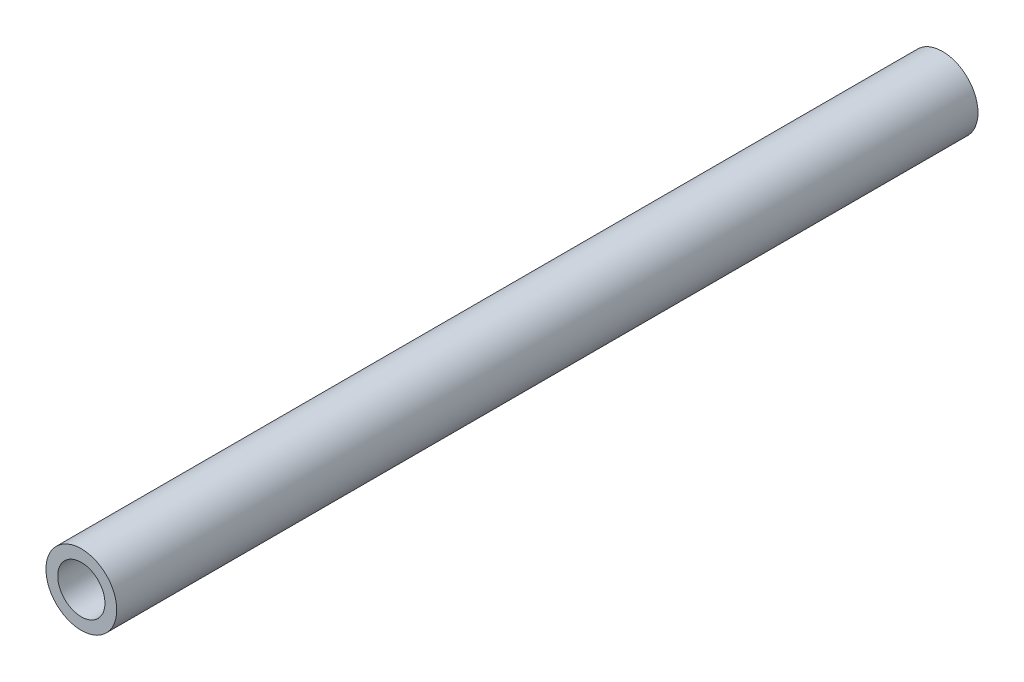
ISO-10303-21;
HEADER;
FILE_DESCRIPTION(('STEP AP214'),'2;1');
FILE_NAME('part.step','',(''),(''),'','','');
FILE_SCHEMA(('AUTOMOTIVE_DESIGN { 1 0 10303 214 1 1 1 1 }'));
ENDSEC;
DATA;
#1=APPLICATION_CONTEXT('core data for automotive mechanical design processes');
#2=APPLICATION_PROTOCOL_DEFINITION('international standard','automotive_design',2000,#1);
#3=PRODUCT_CONTEXT('',#1,'mechanical');
#4=PRODUCT('Part','Part','',(#3));
#5=PRODUCT_RELATED_PRODUCT_CATEGORY('part','',(#4));
#6=PRODUCT_DEFINITION_FORMATION('','',#4);
#7=PRODUCT_DEFINITION_CONTEXT('part definition',#1,'design');
#8=PRODUCT_DEFINITION('design','',#6,#7);
#9=PRODUCT_DEFINITION_SHAPE('','',#8);
#10=(LENGTH_UNIT() NAMED_UNIT(*) SI_UNIT(.MILLI.,.METRE.));
#11=(NAMED_UNIT(*) PLANE_ANGLE_UNIT() SI_UNIT($,.RADIAN.));
#12=(NAMED_UNIT(*) SI_UNIT($,.STERADIAN.) SOLID_ANGLE_UNIT());
#13=UNCERTAINTY_MEASURE_WITH_UNIT(LENGTH_MEASURE(1.E-05),#10,'distance_accuracy_value','');
#14=(GEOMETRIC_REPRESENTATION_CONTEXT(3) GLOBAL_UNCERTAINTY_ASSIGNED_CONTEXT((#13)) GLOBAL_UNIT_ASSIGNED_CONTEXT((#10,
#11,#12)) REPRESENTATION_CONTEXT('',''));
#15=CARTESIAN_POINT('',(0.,0.,0.));
#16=DIRECTION('',(0.,0.,1.));
#17=DIRECTION('',(1.,0.,0.));
#18=AXIS2_PLACEMENT_3D('',#15,#16,#17);
#19=CARTESIAN_POINT('',(-90.,51.5,45.));
#20=DIRECTION('',(0.,0.,1.));
#21=DIRECTION('',(1.,0.,0.));
#22=AXIS2_PLACEMENT_3D('',#19,#20,#21);
#23=CYLINDRICAL_SURFACE('',#22,3.);
#24=CARTESIAN_POINT('',(-90.,51.5,45.));
#25=DIRECTION('',(0.,0.,1.));
#26=DIRECTION('',(1.,0.,0.));
#27=AXIS2_PLACEMENT_3D('',#24,#25,#26);
#28=CIRCLE('',#27,3.);
#29=CARTESIAN_POINT('',(-87.,51.5,45.));
#30=VERTEX_POINT('',#29);
#31=EDGE_CURVE('E10',#30,#30,#28,.T.);
#32=ORIENTED_EDGE('',*,*,#31,.T.);
#33=EDGE_LOOP('',(#32));
#34=FACE_BOUND('',#33,.T.);
#35=CARTESIAN_POINT('',(-90.,51.5,118.));
#36=DIRECTION('',(0.,0.,1.));
#37=DIRECTION('',(1.,0.,0.));
#38=AXIS2_PLACEMENT_3D('',#35,#36,#37);
#39=CIRCLE('',#38,3.);
#40=CARTESIAN_POINT('',(-87.,51.5,118.));
#41=VERTEX_POINT('',#40);
#42=EDGE_CURVE('E45',#41,#41,#39,.T.);
#43=ORIENTED_EDGE('',*,*,#42,.F.);
#44=EDGE_LOOP('',(#43));
#45=FACE_BOUND('',#44,.T.);
#46=ADVANCED_FACE('F39',(#34,#45),#23,.T.);
#47=CARTESIAN_POINT('',(-90.,51.5,45.));
#48=DIRECTION('',(0.,0.,1.));
#49=DIRECTION('',(1.,0.,0.));
#50=AXIS2_PLACEMENT_3D('',#47,#48,#49);
#51=PLANE('',#50);
#52=CARTESIAN_POINT('',(-90.,51.5,45.));
#53=DIRECTION('',(0.,0.,1.));
#54=DIRECTION('',(1.,0.,0.));
#55=AXIS2_PLACEMENT_3D('',#52,#53,#54);
#56=CIRCLE('',#55,2.);
#57=CARTESIAN_POINT('',(-88.,51.5,45.));
#58=VERTEX_POINT('',#57);
#59=EDGE_CURVE('E47',#58,#58,#56,.T.);
#60=ORIENTED_EDGE('',*,*,#59,.T.);
#61=EDGE_LOOP('',(#60));
#62=FACE_BOUND('',#61,.T.);
#63=ORIENTED_EDGE('',*,*,#31,.F.);
#64=EDGE_LOOP('',(#63));
#65=FACE_BOUND('',#64,.T.);
#66=ADVANCED_FACE('F60',(#62,#65),#51,.F.);
#67=CARTESIAN_POINT('',(-90.,51.5,118.));
#68=DIRECTION('',(0.,0.,1.));
#69=DIRECTION('',(1.,0.,0.));
#70=AXIS2_PLACEMENT_3D('',#67,#68,#69);
#71=PLANE('',#70);
#72=CARTESIAN_POINT('',(-90.,51.5,118.));
#73=DIRECTION('',(0.,0.,1.));
#74=DIRECTION('',(1.,0.,0.));
#75=AXIS2_PLACEMENT_3D('',#72,#73,#74);
#76=CIRCLE('',#75,2.);
#77=CARTESIAN_POINT('',(-88.,51.5,118.));
#78=VERTEX_POINT('',#77);
#79=EDGE_CURVE('E51',#78,#78,#76,.T.);
#80=ORIENTED_EDGE('',*,*,#79,.F.);
#81=EDGE_LOOP('',(#80));
#82=FACE_BOUND('',#81,.T.);
#83=ORIENTED_EDGE('',*,*,#42,.T.);
#84=EDGE_LOOP('',(#83));
#85=FACE_BOUND('',#84,.T.);
#86=ADVANCED_FACE('F64',(#82,#85),#71,.T.);
#87=CARTESIAN_POINT('',(-90.,51.5,45.));
#88=DIRECTION('',(0.,0.,1.));
#89=DIRECTION('',(1.,0.,0.));
#90=AXIS2_PLACEMENT_3D('',#87,#88,#89);
#91=CYLINDRICAL_SURFACE('',#90,2.);
#92=ORIENTED_EDGE('',*,*,#59,.F.);
#93=EDGE_LOOP('',(#92));
#94=FACE_BOUND('',#93,.T.);
#95=ORIENTED_EDGE('',*,*,#79,.T.);
#96=EDGE_LOOP('',(#95));
#97=FACE_BOUND('',#96,.T.);
#98=ADVANCED_FACE('F58',(#94,#97),#91,.F.);
#99=CLOSED_SHELL('',(#46,#66,#86,#98));
#100=MANIFOLD_SOLID_BREP('B2',#99);
#101=ADVANCED_BREP_SHAPE_REPRESENTATION('',(#18,#100),#14);
#102=SHAPE_DEFINITION_REPRESENTATION(#9,#101);
ENDSEC;
END-ISO-10303-21;
